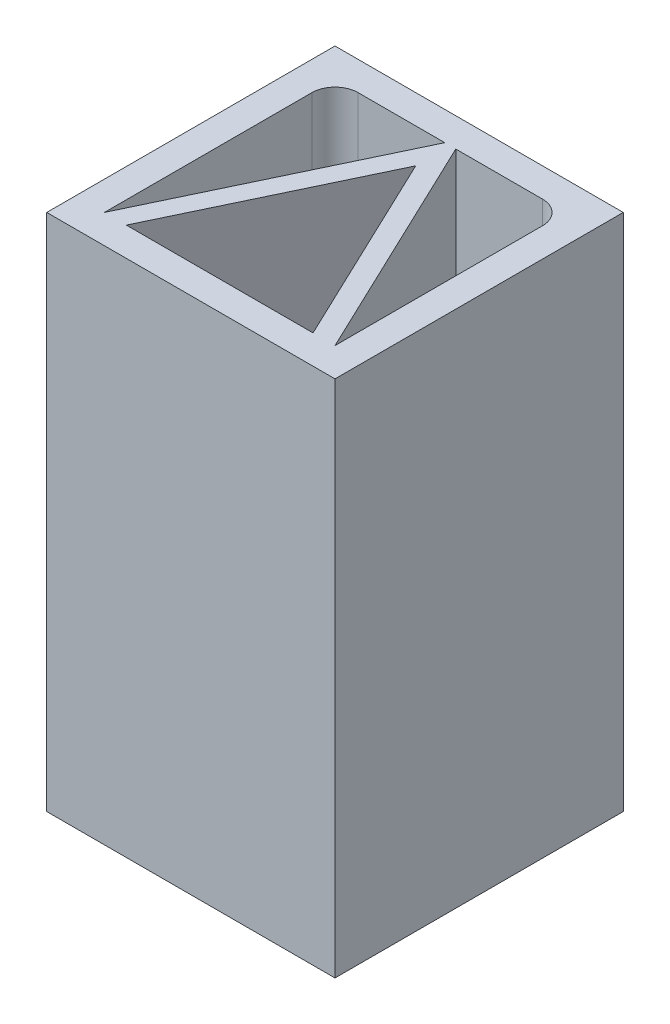
ISO-10303-21;
HEADER;
FILE_DESCRIPTION(('STEP AP214'),'2;1');
FILE_NAME('part.step','',(''),(''),'','','');
FILE_SCHEMA(('AUTOMOTIVE_DESIGN { 1 0 10303 214 1 1 1 1 }'));
ENDSEC;
DATA;
#1=APPLICATION_CONTEXT('core data for automotive mechanical design processes');
#2=APPLICATION_PROTOCOL_DEFINITION('international standard','automotive_design',2000,#1);
#3=PRODUCT_CONTEXT('',#1,'mechanical');
#4=PRODUCT('Part','Part','',(#3));
#5=PRODUCT_RELATED_PRODUCT_CATEGORY('part','',(#4));
#6=PRODUCT_DEFINITION_FORMATION('','',#4);
#7=PRODUCT_DEFINITION_CONTEXT('part definition',#1,'design');
#8=PRODUCT_DEFINITION('design','',#6,#7);
#9=PRODUCT_DEFINITION_SHAPE('','',#8);
#10=(LENGTH_UNIT() NAMED_UNIT(*) SI_UNIT(.MILLI.,.METRE.));
#11=(NAMED_UNIT(*) PLANE_ANGLE_UNIT() SI_UNIT($,.RADIAN.));
#12=(NAMED_UNIT(*) SI_UNIT($,.STERADIAN.) SOLID_ANGLE_UNIT());
#13=UNCERTAINTY_MEASURE_WITH_UNIT(LENGTH_MEASURE(1.E-05),#10,'distance_accuracy_value','');
#14=(GEOMETRIC_REPRESENTATION_CONTEXT(3) GLOBAL_UNCERTAINTY_ASSIGNED_CONTEXT((#13)) GLOBAL_UNIT_ASSIGNED_CONTEXT((#10,
#11,#12)) REPRESENTATION_CONTEXT('',''));
#15=CARTESIAN_POINT('',(0.,0.,0.));
#16=DIRECTION('',(0.,0.,1.));
#17=DIRECTION('',(1.,0.,0.));
#18=AXIS2_PLACEMENT_3D('',#15,#16,#17);
#19=CARTESIAN_POINT('',(2.5,45.,-22.5));
#20=DIRECTION('',(0.,0.,1.));
#21=DIRECTION('',(1.,0.,0.));
#22=AXIS2_PLACEMENT_3D('',#19,#20,#21);
#23=PLANE('',#22);
#24=DIRECTION('',(-1.,0.,0.));
#25=VECTOR('',#24,1.);
#26=CARTESIAN_POINT('',(2.5,0.,-22.5));
#27=LINE('',#26,#25);
#28=CARTESIAN_POINT('',(20.5,0.,-22.5));
#29=VERTEX_POINT('',#28);
#30=CARTESIAN_POINT('',(12.9761904761905,0.,-22.5));
#31=VERTEX_POINT('',#30);
#32=EDGE_CURVE('E200',#29,#31,#27,.T.);
#33=ORIENTED_EDGE('',*,*,#32,.F.);
#34=DIRECTION('',(0.,-1.,0.));
#35=VECTOR('',#34,1.);
#36=CARTESIAN_POINT('',(20.5,45.,-22.5));
#37=LINE('',#36,#35);
#38=CARTESIAN_POINT('',(20.5,45.,-22.5));
#39=VERTEX_POINT('',#38);
#40=EDGE_CURVE('E55',#29,#39,#37,.F.);
#41=ORIENTED_EDGE('',*,*,#40,.T.);
#42=DIRECTION('',(-1.,0.,0.));
#43=VECTOR('',#42,1.);
#44=CARTESIAN_POINT('',(2.5,45.,-22.5));
#45=LINE('',#44,#43);
#46=CARTESIAN_POINT('',(12.9761904761905,45.,-22.5));
#47=VERTEX_POINT('',#46);
#48=EDGE_CURVE('E208',#39,#47,#45,.T.);
#49=ORIENTED_EDGE('',*,*,#48,.T.);
#50=DIRECTION('',(0.,1.,0.));
#51=VECTOR('',#50,1.);
#52=CARTESIAN_POINT('',(12.9761904761905,45.,-22.5));
#53=LINE('',#52,#51);
#54=EDGE_CURVE('E277',#31,#47,#53,.T.);
#55=ORIENTED_EDGE('',*,*,#54,.F.);
#56=EDGE_LOOP('',(#33,#41,#49,#55));
#57=FACE_BOUND('',#56,.T.);
#58=ADVANCED_FACE('F39',(#57),#23,.T.);
#59=CARTESIAN_POINT('',(0.,45.,0.));
#60=DIRECTION('',(0.,-1.,0.));
#61=DIRECTION('',(0.,0.,-1.));
#62=AXIS2_PLACEMENT_3D('',#59,#60,#61);
#63=PLANE('',#62);
#64=DIRECTION('',(0.429933580392347,0.,0.90286051882393));
#65=VECTOR('',#64,1.);
#66=CARTESIAN_POINT('',(22.5,45.,-2.5));
#67=LINE('',#66,#65);
#68=CARTESIAN_POINT('',(22.5,45.,-2.5));
#69=VERTEX_POINT('',#68);
#70=EDGE_CURVE('E181',#47,#69,#67,.T.);
#71=ORIENTED_EDGE('',*,*,#70,.F.);
#72=ORIENTED_EDGE('',*,*,#48,.F.);
#73=CARTESIAN_POINT('',(20.5,45.,-20.5));
#74=DIRECTION('',(0.,-1.,0.));
#75=DIRECTION('',(0.,0.,-1.));
#76=AXIS2_PLACEMENT_3D('',#73,#74,#75);
#77=CIRCLE('',#76,2.);
#78=CARTESIAN_POINT('',(22.5,45.,-20.5));
#79=VERTEX_POINT('',#78);
#80=EDGE_CURVE('E11',#39,#79,#77,.T.);
#81=ORIENTED_EDGE('',*,*,#80,.T.);
#82=DIRECTION('',(0.,0.,-1.));
#83=VECTOR('',#82,1.);
#84=CARTESIAN_POINT('',(22.5,45.,-22.5));
#85=LINE('',#84,#83);
#86=EDGE_CURVE('E203',#69,#79,#85,.T.);
#87=ORIENTED_EDGE('',*,*,#86,.F.);
#88=EDGE_LOOP('',(#71,#72,#81,#87));
#89=FACE_BOUND('',#88,.T.);
#90=DIRECTION('',(-0.429933580392348,0.,-0.90286051882393));
#91=VECTOR('',#90,1.);
#92=CARTESIAN_POINT('',(20.5952380952381,45.,-2.5));
#93=LINE('',#92,#91);
#94=CARTESIAN_POINT('',(20.5952380952381,45.,-2.5));
#95=VERTEX_POINT('',#94);
#96=CARTESIAN_POINT('',(12.5,45.,-19.5));
#97=VERTEX_POINT('',#96);
#98=EDGE_CURVE('E164',#95,#97,#93,.T.);
#99=ORIENTED_EDGE('',*,*,#98,.F.);
#100=DIRECTION('',(1.,0.,0.));
#101=VECTOR('',#100,1.);
#102=CARTESIAN_POINT('',(2.5,45.,-2.5));
#103=LINE('',#102,#101);
#104=CARTESIAN_POINT('',(4.40476190476191,45.,-2.5));
#105=VERTEX_POINT('',#104);
#106=EDGE_CURVE('E165',#105,#95,#103,.T.);
#107=ORIENTED_EDGE('',*,*,#106,.F.);
#108=DIRECTION('',(-0.429933580392348,0.,0.90286051882393));
#109=VECTOR('',#108,1.);
#110=CARTESIAN_POINT('',(12.5,45.,-19.5));
#111=LINE('',#110,#109);
#112=EDGE_CURVE('E148',#97,#105,#111,.T.);
#113=ORIENTED_EDGE('',*,*,#112,.F.);
#114=EDGE_LOOP('',(#99,#107,#113));
#115=FACE_BOUND('',#114,.T.);
#116=DIRECTION('',(0.,0.,1.));
#117=VECTOR('',#116,1.);
#118=CARTESIAN_POINT('',(0.,45.,0.));
#119=LINE('',#118,#117);
#120=CARTESIAN_POINT('',(0.,45.,-25.));
#121=VERTEX_POINT('',#120);
#122=CARTESIAN_POINT('',(0.,45.,0.));
#123=VERTEX_POINT('',#122);
#124=EDGE_CURVE('E232',#121,#123,#119,.T.);
#125=ORIENTED_EDGE('',*,*,#124,.T.);
#126=DIRECTION('',(1.,0.,0.));
#127=VECTOR('',#126,1.);
#128=CARTESIAN_POINT('',(0.,45.,0.));
#129=LINE('',#128,#127);
#130=CARTESIAN_POINT('',(25.,45.,0.));
#131=VERTEX_POINT('',#130);
#132=EDGE_CURVE('E236',#123,#131,#129,.T.);
#133=ORIENTED_EDGE('',*,*,#132,.T.);
#134=DIRECTION('',(0.,0.,-1.));
#135=VECTOR('',#134,1.);
#136=CARTESIAN_POINT('',(25.,45.,0.));
#137=LINE('',#136,#135);
#138=CARTESIAN_POINT('',(25.,45.,-25.));
#139=VERTEX_POINT('',#138);
#140=EDGE_CURVE('E240',#131,#139,#137,.T.);
#141=ORIENTED_EDGE('',*,*,#140,.T.);
#142=DIRECTION('',(-1.,0.,0.));
#143=VECTOR('',#142,1.);
#144=CARTESIAN_POINT('',(0.,45.,-25.));
#145=LINE('',#144,#143);
#146=EDGE_CURVE('E243',#139,#121,#145,.T.);
#147=ORIENTED_EDGE('',*,*,#146,.T.);
#148=EDGE_LOOP('',(#125,#133,#141,#147));
#149=FACE_BOUND('',#148,.T.);
#150=CARTESIAN_POINT('',(12.0238095238095,45.,-22.5));
#151=VERTEX_POINT('',#150);
#152=CARTESIAN_POINT('',(4.5,45.,-22.5));
#153=VERTEX_POINT('',#152);
#154=EDGE_CURVE('E207',#151,#153,#45,.T.);
#155=ORIENTED_EDGE('',*,*,#154,.F.);
#156=DIRECTION('',(0.429933580392347,0.,-0.90286051882393));
#157=VECTOR('',#156,1.);
#158=CARTESIAN_POINT('',(12.5,45.,-23.5));
#159=LINE('',#158,#157);
#160=CARTESIAN_POINT('',(2.5,45.,-2.5));
#161=VERTEX_POINT('',#160);
#162=EDGE_CURVE('E167',#161,#151,#159,.T.);
#163=ORIENTED_EDGE('',*,*,#162,.F.);
#164=DIRECTION('',(0.,0.,1.));
#165=VECTOR('',#164,1.);
#166=CARTESIAN_POINT('',(2.5,45.,-22.5));
#167=LINE('',#166,#165);
#168=CARTESIAN_POINT('',(2.5,45.,-20.5));
#169=VERTEX_POINT('',#168);
#170=EDGE_CURVE('E197',#169,#161,#167,.T.);
#171=ORIENTED_EDGE('',*,*,#170,.F.);
#172=CARTESIAN_POINT('',(4.5,45.,-20.5));
#173=DIRECTION('',(0.,-1.,0.));
#174=DIRECTION('',(0.,0.,-1.));
#175=AXIS2_PLACEMENT_3D('',#172,#173,#174);
#176=CIRCLE('',#175,2.);
#177=EDGE_CURVE('E297',#169,#153,#176,.T.);
#178=ORIENTED_EDGE('',*,*,#177,.T.);
#179=EDGE_LOOP('',(#155,#163,#171,#178));
#180=FACE_BOUND('',#179,.T.);
#181=ADVANCED_FACE('F162',(#89,#115,#149,#180),#63,.F.);
#182=CARTESIAN_POINT('',(0.,0.,0.));
#183=DIRECTION('',(0.,-1.,0.));
#184=DIRECTION('',(0.,0.,-1.));
#185=AXIS2_PLACEMENT_3D('',#182,#183,#184);
#186=PLANE('',#185);
#187=DIRECTION('',(0.,0.,-1.));
#188=VECTOR('',#187,1.);
#189=CARTESIAN_POINT('',(22.5,0.,-22.5));
#190=LINE('',#189,#188);
#191=CARTESIAN_POINT('',(22.5,0.,-2.5));
#192=VERTEX_POINT('',#191);
#193=CARTESIAN_POINT('',(22.5,0.,-20.5));
#194=VERTEX_POINT('',#193);
#195=EDGE_CURVE('E218',#192,#194,#190,.T.);
#196=ORIENTED_EDGE('',*,*,#195,.T.);
#197=CARTESIAN_POINT('',(20.5,0.,-20.5));
#198=DIRECTION('',(0.,-1.,0.));
#199=DIRECTION('',(0.,0.,-1.));
#200=AXIS2_PLACEMENT_3D('',#197,#198,#199);
#201=CIRCLE('',#200,2.);
#202=EDGE_CURVE('E48',#194,#29,#201,.F.);
#203=ORIENTED_EDGE('',*,*,#202,.T.);
#204=ORIENTED_EDGE('',*,*,#32,.T.);
#205=DIRECTION('',(0.429933580392347,0.,0.90286051882393));
#206=VECTOR('',#205,1.);
#207=CARTESIAN_POINT('',(22.5,0.,-2.5));
#208=LINE('',#207,#206);
#209=EDGE_CURVE('E172',#31,#192,#208,.T.);
#210=ORIENTED_EDGE('',*,*,#209,.T.);
#211=EDGE_LOOP('',(#196,#203,#204,#210));
#212=FACE_BOUND('',#211,.T.);
#213=DIRECTION('',(1.,0.,0.));
#214=VECTOR('',#213,1.);
#215=CARTESIAN_POINT('',(2.5,0.,-2.5));
#216=LINE('',#215,#214);
#217=CARTESIAN_POINT('',(4.40476190476191,0.,-2.5));
#218=VERTEX_POINT('',#217);
#219=CARTESIAN_POINT('',(20.5952380952381,0.,-2.5));
#220=VERTEX_POINT('',#219);
#221=EDGE_CURVE('E214',#218,#220,#216,.T.);
#222=ORIENTED_EDGE('',*,*,#221,.T.);
#223=DIRECTION('',(-0.429933580392348,0.,-0.90286051882393));
#224=VECTOR('',#223,1.);
#225=CARTESIAN_POINT('',(20.5952380952381,0.,-2.5));
#226=LINE('',#225,#224);
#227=CARTESIAN_POINT('',(12.5,0.,-19.5));
#228=VERTEX_POINT('',#227);
#229=EDGE_CURVE('E185',#220,#228,#226,.T.);
#230=ORIENTED_EDGE('',*,*,#229,.T.);
#231=DIRECTION('',(-0.429933580392348,0.,0.90286051882393));
#232=VECTOR('',#231,1.);
#233=CARTESIAN_POINT('',(12.5,0.,-19.5));
#234=LINE('',#233,#232);
#235=EDGE_CURVE('E150',#228,#218,#234,.T.);
#236=ORIENTED_EDGE('',*,*,#235,.T.);
#237=EDGE_LOOP('',(#222,#230,#236));
#238=FACE_BOUND('',#237,.T.);
#239=DIRECTION('',(0.429933580392347,0.,-0.90286051882393));
#240=VECTOR('',#239,1.);
#241=CARTESIAN_POINT('',(12.5,0.,-23.5));
#242=LINE('',#241,#240);
#243=CARTESIAN_POINT('',(2.5,0.,-2.5));
#244=VERTEX_POINT('',#243);
#245=CARTESIAN_POINT('',(12.0238095238095,0.,-22.5));
#246=VERTEX_POINT('',#245);
#247=EDGE_CURVE('E176',#244,#246,#242,.T.);
#248=ORIENTED_EDGE('',*,*,#247,.T.);
#249=CARTESIAN_POINT('',(4.5,0.,-22.5));
#250=VERTEX_POINT('',#249);
#251=EDGE_CURVE('E221',#246,#250,#27,.T.);
#252=ORIENTED_EDGE('',*,*,#251,.T.);
#253=CARTESIAN_POINT('',(4.5,0.,-20.5));
#254=DIRECTION('',(0.,-1.,0.));
#255=DIRECTION('',(0.,0.,-1.));
#256=AXIS2_PLACEMENT_3D('',#253,#254,#255);
#257=CIRCLE('',#256,2.);
#258=CARTESIAN_POINT('',(2.5,0.,-20.5));
#259=VERTEX_POINT('',#258);
#260=EDGE_CURVE('E294',#250,#259,#257,.F.);
#261=ORIENTED_EDGE('',*,*,#260,.T.);
#262=DIRECTION('',(0.,0.,1.));
#263=VECTOR('',#262,1.);
#264=CARTESIAN_POINT('',(2.5,0.,-22.5));
#265=LINE('',#264,#263);
#266=EDGE_CURVE('E193',#259,#244,#265,.T.);
#267=ORIENTED_EDGE('',*,*,#266,.T.);
#268=EDGE_LOOP('',(#248,#252,#261,#267));
#269=FACE_BOUND('',#268,.T.);
#270=DIRECTION('',(0.,0.,1.));
#271=VECTOR('',#270,1.);
#272=CARTESIAN_POINT('',(0.,0.,0.));
#273=LINE('',#272,#271);
#274=CARTESIAN_POINT('',(0.,0.,-25.));
#275=VERTEX_POINT('',#274);
#276=CARTESIAN_POINT('',(0.,0.,0.));
#277=VERTEX_POINT('',#276);
#278=EDGE_CURVE('E231',#275,#277,#273,.T.);
#279=ORIENTED_EDGE('',*,*,#278,.F.);
#280=DIRECTION('',(-1.,0.,0.));
#281=VECTOR('',#280,1.);
#282=CARTESIAN_POINT('',(0.,0.,-25.));
#283=LINE('',#282,#281);
#284=CARTESIAN_POINT('',(25.,0.,-25.));
#285=VERTEX_POINT('',#284);
#286=EDGE_CURVE('E237',#285,#275,#283,.T.);
#287=ORIENTED_EDGE('',*,*,#286,.F.);
#288=DIRECTION('',(0.,0.,-1.));
#289=VECTOR('',#288,1.);
#290=CARTESIAN_POINT('',(25.,0.,0.));
#291=LINE('',#290,#289);
#292=CARTESIAN_POINT('',(25.,0.,0.));
#293=VERTEX_POINT('',#292);
#294=EDGE_CURVE('E253',#293,#285,#291,.T.);
#295=ORIENTED_EDGE('',*,*,#294,.F.);
#296=DIRECTION('',(1.,0.,0.));
#297=VECTOR('',#296,1.);
#298=CARTESIAN_POINT('',(0.,0.,0.));
#299=LINE('',#298,#297);
#300=EDGE_CURVE('E250',#277,#293,#299,.T.);
#301=ORIENTED_EDGE('',*,*,#300,.F.);
#302=EDGE_LOOP('',(#279,#287,#295,#301));
#303=FACE_BOUND('',#302,.T.);
#304=ADVANCED_FACE('F306',(#212,#238,#269,#303),#186,.T.);
#305=CARTESIAN_POINT('',(0.,45.,0.));
#306=DIRECTION('',(1.,0.,0.));
#307=DIRECTION('',(0.,0.,-1.));
#308=AXIS2_PLACEMENT_3D('',#305,#306,#307);
#309=PLANE('',#308);
#310=ORIENTED_EDGE('',*,*,#278,.T.);
#311=DIRECTION('',(0.,-1.,0.));
#312=VECTOR('',#311,1.);
#313=CARTESIAN_POINT('',(0.,45.,0.));
#314=LINE('',#313,#312);
#315=EDGE_CURVE('E269',#123,#277,#314,.T.);
#316=ORIENTED_EDGE('',*,*,#315,.F.);
#317=ORIENTED_EDGE('',*,*,#124,.F.);
#318=DIRECTION('',(0.,-1.,0.));
#319=VECTOR('',#318,1.);
#320=CARTESIAN_POINT('',(0.,45.,-25.));
#321=LINE('',#320,#319);
#322=EDGE_CURVE('E246',#121,#275,#321,.T.);
#323=ORIENTED_EDGE('',*,*,#322,.T.);
#324=EDGE_LOOP('',(#310,#316,#317,#323));
#325=FACE_BOUND('',#324,.T.);
#326=ADVANCED_FACE('F364',(#325),#309,.F.);
#327=CARTESIAN_POINT('',(0.,45.,0.));
#328=DIRECTION('',(0.,0.,-1.));
#329=DIRECTION('',(-1.,0.,0.));
#330=AXIS2_PLACEMENT_3D('',#327,#328,#329);
#331=PLANE('',#330);
#332=ORIENTED_EDGE('',*,*,#300,.T.);
#333=DIRECTION('',(0.,-1.,0.));
#334=VECTOR('',#333,1.);
#335=CARTESIAN_POINT('',(25.,45.,0.));
#336=LINE('',#335,#334);
#337=EDGE_CURVE('E265',#131,#293,#336,.T.);
#338=ORIENTED_EDGE('',*,*,#337,.F.);
#339=ORIENTED_EDGE('',*,*,#132,.F.);
#340=ORIENTED_EDGE('',*,*,#315,.T.);
#341=EDGE_LOOP('',(#332,#338,#339,#340));
#342=FACE_BOUND('',#341,.T.);
#343=ADVANCED_FACE('F371',(#342),#331,.F.);
#344=CARTESIAN_POINT('',(25.,45.,0.));
#345=DIRECTION('',(-1.,0.,0.));
#346=DIRECTION('',(0.,0.,1.));
#347=AXIS2_PLACEMENT_3D('',#344,#345,#346);
#348=PLANE('',#347);
#349=ORIENTED_EDGE('',*,*,#294,.T.);
#350=DIRECTION('',(0.,-1.,0.));
#351=VECTOR('',#350,1.);
#352=CARTESIAN_POINT('',(25.,45.,-25.));
#353=LINE('',#352,#351);
#354=EDGE_CURVE('E261',#139,#285,#353,.T.);
#355=ORIENTED_EDGE('',*,*,#354,.F.);
#356=ORIENTED_EDGE('',*,*,#140,.F.);
#357=ORIENTED_EDGE('',*,*,#337,.T.);
#358=EDGE_LOOP('',(#349,#355,#356,#357));
#359=FACE_BOUND('',#358,.T.);
#360=ADVANCED_FACE('F367',(#359),#348,.F.);
#361=CARTESIAN_POINT('',(0.,45.,-25.));
#362=DIRECTION('',(0.,0.,1.));
#363=DIRECTION('',(1.,0.,0.));
#364=AXIS2_PLACEMENT_3D('',#361,#362,#363);
#365=PLANE('',#364);
#366=ORIENTED_EDGE('',*,*,#286,.T.);
#367=ORIENTED_EDGE('',*,*,#322,.F.);
#368=ORIENTED_EDGE('',*,*,#146,.F.);
#369=ORIENTED_EDGE('',*,*,#354,.T.);
#370=EDGE_LOOP('',(#366,#367,#368,#369));
#371=FACE_BOUND('',#370,.T.);
#372=ADVANCED_FACE('F360',(#371),#365,.F.);
#373=CARTESIAN_POINT('',(2.5,45.,-22.5));
#374=DIRECTION('',(1.,0.,0.));
#375=DIRECTION('',(0.,0.,-1.));
#376=AXIS2_PLACEMENT_3D('',#373,#374,#375);
#377=PLANE('',#376);
#378=ORIENTED_EDGE('',*,*,#266,.F.);
#379=DIRECTION('',(0.,-1.,0.));
#380=VECTOR('',#379,1.);
#381=CARTESIAN_POINT('',(2.5,45.,-20.5));
#382=LINE('',#381,#380);
#383=EDGE_CURVE('E285',#259,#169,#382,.F.);
#384=ORIENTED_EDGE('',*,*,#383,.T.);
#385=ORIENTED_EDGE('',*,*,#170,.T.);
#386=DIRECTION('',(0.,-1.,0.));
#387=VECTOR('',#386,1.);
#388=CARTESIAN_POINT('',(2.5,45.,-2.5));
#389=LINE('',#388,#387);
#390=EDGE_CURVE('E227',#161,#244,#389,.T.);
#391=ORIENTED_EDGE('',*,*,#390,.T.);
#392=EDGE_LOOP('',(#378,#384,#385,#391));
#393=FACE_BOUND('',#392,.T.);
#394=ADVANCED_FACE('F321',(#393),#377,.T.);
#395=CARTESIAN_POINT('',(2.5,45.,-2.5));
#396=DIRECTION('',(0.,0.,-1.));
#397=DIRECTION('',(-1.,0.,0.));
#398=AXIS2_PLACEMENT_3D('',#395,#396,#397);
#399=PLANE('',#398);
#400=DIRECTION('',(0.,-1.,0.));
#401=VECTOR('',#400,1.);
#402=CARTESIAN_POINT('',(4.40476190476191,45.,-2.5));
#403=LINE('',#402,#401);
#404=EDGE_CURVE('E156',#105,#218,#403,.T.);
#405=ORIENTED_EDGE('',*,*,#404,.F.);
#406=ORIENTED_EDGE('',*,*,#106,.T.);
#407=DIRECTION('',(0.,-1.,0.));
#408=VECTOR('',#407,1.);
#409=CARTESIAN_POINT('',(20.5952380952381,45.,-2.5));
#410=LINE('',#409,#408);
#411=EDGE_CURVE('E157',#95,#220,#410,.T.);
#412=ORIENTED_EDGE('',*,*,#411,.T.);
#413=ORIENTED_EDGE('',*,*,#221,.F.);
#414=EDGE_LOOP('',(#405,#406,#412,#413));
#415=FACE_BOUND('',#414,.T.);
#416=ADVANCED_FACE('F351',(#415),#399,.T.);
#417=CARTESIAN_POINT('',(22.5,45.,-22.5));
#418=DIRECTION('',(-1.,0.,0.));
#419=DIRECTION('',(0.,0.,1.));
#420=AXIS2_PLACEMENT_3D('',#417,#418,#419);
#421=PLANE('',#420);
#422=ORIENTED_EDGE('',*,*,#86,.T.);
#423=DIRECTION('',(0.,-1.,0.));
#424=VECTOR('',#423,1.);
#425=CARTESIAN_POINT('',(22.5,0.,-20.5));
#426=LINE('',#425,#424);
#427=EDGE_CURVE('E288',#79,#194,#426,.T.);
#428=ORIENTED_EDGE('',*,*,#427,.T.);
#429=ORIENTED_EDGE('',*,*,#195,.F.);
#430=DIRECTION('',(0.,-1.,0.));
#431=VECTOR('',#430,1.);
#432=CARTESIAN_POINT('',(22.5,45.,-2.5));
#433=LINE('',#432,#431);
#434=EDGE_CURVE('E211',#69,#192,#433,.T.);
#435=ORIENTED_EDGE('',*,*,#434,.F.);
#436=EDGE_LOOP('',(#422,#428,#429,#435));
#437=FACE_BOUND('',#436,.T.);
#438=ADVANCED_FACE('F347',(#437),#421,.T.);
#439=ORIENTED_EDGE('',*,*,#154,.T.);
#440=DIRECTION('',(0.,-1.,0.));
#441=VECTOR('',#440,1.);
#442=CARTESIAN_POINT('',(4.5,0.,-22.5));
#443=LINE('',#442,#441);
#444=EDGE_CURVE('E281',#153,#250,#443,.T.);
#445=ORIENTED_EDGE('',*,*,#444,.T.);
#446=ORIENTED_EDGE('',*,*,#251,.F.);
#447=DIRECTION('',(0.,-1.,0.));
#448=VECTOR('',#447,1.);
#449=CARTESIAN_POINT('',(12.0238095238095,45.,-22.5));
#450=LINE('',#449,#448);
#451=EDGE_CURVE('E273',#151,#246,#450,.T.);
#452=ORIENTED_EDGE('',*,*,#451,.F.);
#453=EDGE_LOOP('',(#439,#445,#446,#452));
#454=FACE_BOUND('',#453,.T.);
#455=ADVANCED_FACE('F312',(#454),#23,.T.);
#456=CARTESIAN_POINT('',(22.5,45.,-2.5));
#457=DIRECTION('',(0.90286051882393,0.,-0.429933580392348));
#458=DIRECTION('',(-0.429933580392348,0.,-0.90286051882393));
#459=AXIS2_PLACEMENT_3D('',#456,#457,#458);
#460=PLANE('',#459);
#461=ORIENTED_EDGE('',*,*,#209,.F.);
#462=ORIENTED_EDGE('',*,*,#54,.T.);
#463=ORIENTED_EDGE('',*,*,#70,.T.);
#464=ORIENTED_EDGE('',*,*,#434,.T.);
#465=EDGE_LOOP('',(#461,#462,#463,#464));
#466=FACE_BOUND('',#465,.T.);
#467=ADVANCED_FACE('F328',(#466),#460,.T.);
#468=CARTESIAN_POINT('',(12.5,45.,-23.5));
#469=DIRECTION('',(-0.90286051882393,0.,-0.429933580392348));
#470=DIRECTION('',(-0.429933580392348,0.,0.90286051882393));
#471=AXIS2_PLACEMENT_3D('',#468,#469,#470);
#472=PLANE('',#471);
#473=ORIENTED_EDGE('',*,*,#162,.T.);
#474=ORIENTED_EDGE('',*,*,#451,.T.);
#475=ORIENTED_EDGE('',*,*,#247,.F.);
#476=ORIENTED_EDGE('',*,*,#390,.F.);
#477=EDGE_LOOP('',(#473,#474,#475,#476));
#478=FACE_BOUND('',#477,.T.);
#479=ADVANCED_FACE('F326',(#478),#472,.T.);
#480=CARTESIAN_POINT('',(12.5,45.,-19.5));
#481=DIRECTION('',(0.90286051882393,0.,0.429933580392348));
#482=DIRECTION('',(0.429933580392348,0.,-0.902860518823931));
#483=AXIS2_PLACEMENT_3D('',#480,#481,#482);
#484=PLANE('',#483);
#485=ORIENTED_EDGE('',*,*,#235,.F.);
#486=DIRECTION('',(0.,-1.,0.));
#487=VECTOR('',#486,1.);
#488=CARTESIAN_POINT('',(12.5,45.,-19.5));
#489=LINE('',#488,#487);
#490=EDGE_CURVE('E144',#97,#228,#489,.T.);
#491=ORIENTED_EDGE('',*,*,#490,.F.);
#492=ORIENTED_EDGE('',*,*,#112,.T.);
#493=ORIENTED_EDGE('',*,*,#404,.T.);
#494=EDGE_LOOP('',(#485,#491,#492,#493));
#495=FACE_BOUND('',#494,.T.);
#496=ADVANCED_FACE('F146',(#495),#484,.T.);
#497=CARTESIAN_POINT('',(20.5952380952381,45.,-2.5));
#498=DIRECTION('',(-0.90286051882393,0.,0.429933580392348));
#499=DIRECTION('',(0.429933580392348,0.,0.902860518823931));
#500=AXIS2_PLACEMENT_3D('',#497,#498,#499);
#501=PLANE('',#500);
#502=ORIENTED_EDGE('',*,*,#229,.F.);
#503=ORIENTED_EDGE('',*,*,#411,.F.);
#504=ORIENTED_EDGE('',*,*,#98,.T.);
#505=ORIENTED_EDGE('',*,*,#490,.T.);
#506=EDGE_LOOP('',(#502,#503,#504,#505));
#507=FACE_BOUND('',#506,.T.);
#508=ADVANCED_FACE('F170',(#507),#501,.T.);
#509=CARTESIAN_POINT('',(4.5,45.,-20.5));
#510=DIRECTION('',(0.,1.,0.));
#511=DIRECTION('',(0.,0.,1.));
#512=AXIS2_PLACEMENT_3D('',#509,#510,#511);
#513=CYLINDRICAL_SURFACE('',#512,2.);
#514=ORIENTED_EDGE('',*,*,#177,.F.);
#515=ORIENTED_EDGE('',*,*,#383,.F.);
#516=ORIENTED_EDGE('',*,*,#260,.F.);
#517=ORIENTED_EDGE('',*,*,#444,.F.);
#518=EDGE_LOOP('',(#514,#515,#516,#517));
#519=FACE_BOUND('',#518,.T.);
#520=ADVANCED_FACE('F317',(#519),#513,.F.);
#521=CARTESIAN_POINT('',(20.5,45.,-20.5));
#522=DIRECTION('',(0.,1.,0.));
#523=DIRECTION('',(0.,0.,1.));
#524=AXIS2_PLACEMENT_3D('',#521,#522,#523);
#525=CYLINDRICAL_SURFACE('',#524,2.);
#526=ORIENTED_EDGE('',*,*,#80,.F.);
#527=ORIENTED_EDGE('',*,*,#40,.F.);
#528=ORIENTED_EDGE('',*,*,#202,.F.);
#529=ORIENTED_EDGE('',*,*,#427,.F.);
#530=EDGE_LOOP('',(#526,#527,#528,#529));
#531=FACE_BOUND('',#530,.T.);
#532=ADVANCED_FACE('F41',(#531),#525,.F.);
#533=CLOSED_SHELL('',(#58,#181,#304,#326,#343,#360,#372,#394,#416,#438,#455,#467,#479,#496,#508,
#520,#532));
#534=MANIFOLD_SOLID_BREP('B2',#533);
#535=ADVANCED_BREP_SHAPE_REPRESENTATION('',(#18,#534),#14);
#536=SHAPE_DEFINITION_REPRESENTATION(#9,#535);
ENDSEC;
END-ISO-10303-21;
